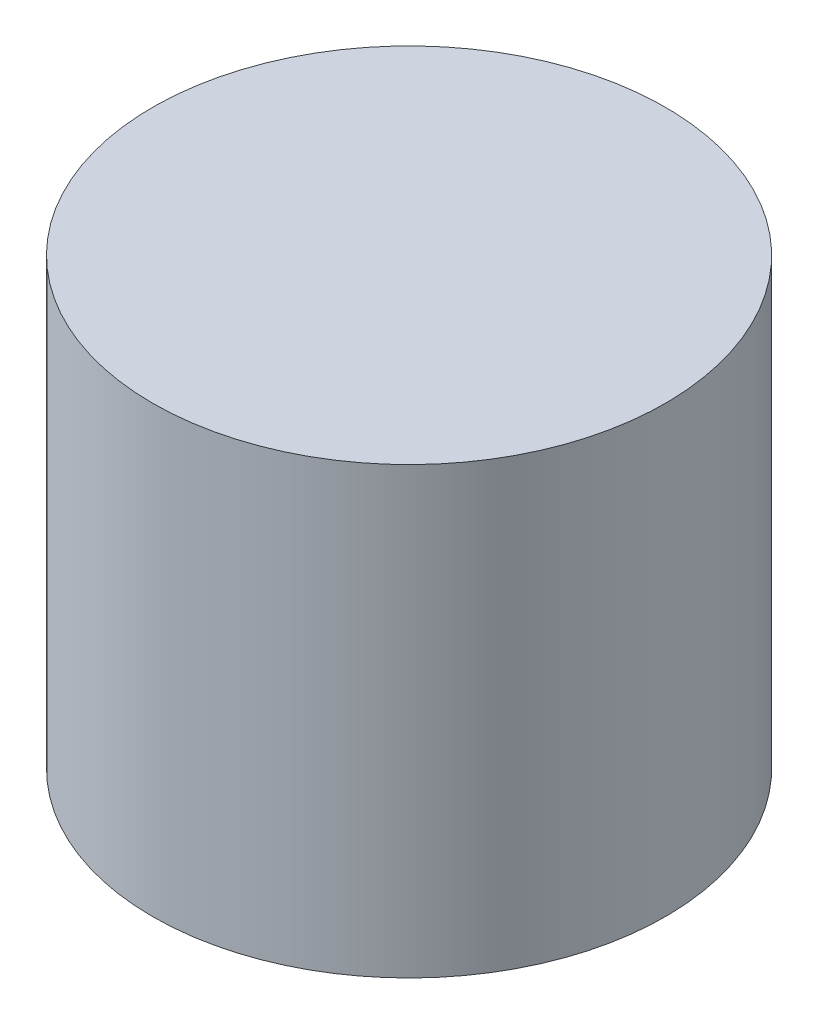
ISO-10303-21;
HEADER;
FILE_DESCRIPTION(('STEP AP214'),'2;1');
FILE_NAME('part.step','',(''),(''),'','','');
FILE_SCHEMA(('AUTOMOTIVE_DESIGN { 1 0 10303 214 1 1 1 1 }'));
ENDSEC;
DATA;
#1=APPLICATION_CONTEXT('core data for automotive mechanical design processes');
#2=APPLICATION_PROTOCOL_DEFINITION('international standard','automotive_design',2000,#1);
#3=PRODUCT_CONTEXT('',#1,'mechanical');
#4=PRODUCT('Part','Part','',(#3));
#5=PRODUCT_RELATED_PRODUCT_CATEGORY('part','',(#4));
#6=PRODUCT_DEFINITION_FORMATION('','',#4);
#7=PRODUCT_DEFINITION_CONTEXT('part definition',#1,'design');
#8=PRODUCT_DEFINITION('design','',#6,#7);
#9=PRODUCT_DEFINITION_SHAPE('','',#8);
#10=(LENGTH_UNIT() NAMED_UNIT(*) SI_UNIT(.MILLI.,.METRE.));
#11=(NAMED_UNIT(*) PLANE_ANGLE_UNIT() SI_UNIT($,.RADIAN.));
#12=(NAMED_UNIT(*) SI_UNIT($,.STERADIAN.) SOLID_ANGLE_UNIT());
#13=UNCERTAINTY_MEASURE_WITH_UNIT(LENGTH_MEASURE(1.E-05),#10,'distance_accuracy_value','');
#14=(GEOMETRIC_REPRESENTATION_CONTEXT(3) GLOBAL_UNCERTAINTY_ASSIGNED_CONTEXT((#13)) GLOBAL_UNIT_ASSIGNED_CONTEXT((#10,
#11,#12)) REPRESENTATION_CONTEXT('',''));
#15=CARTESIAN_POINT('',(0.,0.,0.));
#16=DIRECTION('',(0.,0.,1.));
#17=DIRECTION('',(1.,0.,0.));
#18=AXIS2_PLACEMENT_3D('',#15,#16,#17);
#19=CARTESIAN_POINT('',(0.,10.57,0.));
#20=DIRECTION('',(0.,-1.,0.));
#21=DIRECTION('',(0.,0.,-1.));
#22=AXIS2_PLACEMENT_3D('',#19,#20,#21);
#23=CYLINDRICAL_SURFACE('',#22,6.095);
#24=CARTESIAN_POINT('',(0.,10.57,0.));
#25=DIRECTION('',(0.,1.,0.));
#26=DIRECTION('',(0.,0.,1.));
#27=AXIS2_PLACEMENT_3D('',#24,#25,#26);
#28=CIRCLE('',#27,6.095);
#29=CARTESIAN_POINT('',(0.,10.57,6.095));
#30=VERTEX_POINT('',#29);
#31=EDGE_CURVE('E10',#30,#30,#28,.T.);
#32=ORIENTED_EDGE('',*,*,#31,.F.);
#33=EDGE_LOOP('',(#32));
#34=FACE_BOUND('',#33,.T.);
#35=CARTESIAN_POINT('',(0.,0.,0.));
#36=DIRECTION('',(0.,1.,0.));
#37=DIRECTION('',(0.,0.,1.));
#38=AXIS2_PLACEMENT_3D('',#35,#36,#37);
#39=CIRCLE('',#38,6.095);
#40=CARTESIAN_POINT('',(0.,0.,6.095));
#41=VERTEX_POINT('',#40);
#42=EDGE_CURVE('E34',#41,#41,#39,.T.);
#43=ORIENTED_EDGE('',*,*,#42,.T.);
#44=EDGE_LOOP('',(#43));
#45=FACE_BOUND('',#44,.T.);
#46=ADVANCED_FACE('F31',(#34,#45),#23,.T.);
#47=CARTESIAN_POINT('',(0.,10.57,0.));
#48=DIRECTION('',(0.,1.,0.));
#49=DIRECTION('',(0.,0.,1.));
#50=AXIS2_PLACEMENT_3D('',#47,#48,#49);
#51=PLANE('',#50);
#52=ORIENTED_EDGE('',*,*,#31,.T.);
#53=EDGE_LOOP('',(#52));
#54=FACE_BOUND('',#53,.T.);
#55=ADVANCED_FACE('F46',(#54),#51,.T.);
#56=CARTESIAN_POINT('',(0.,0.,0.));
#57=DIRECTION('',(0.,1.,0.));
#58=DIRECTION('',(0.,0.,1.));
#59=AXIS2_PLACEMENT_3D('',#56,#57,#58);
#60=PLANE('',#59);
#61=ORIENTED_EDGE('',*,*,#42,.F.);
#62=EDGE_LOOP('',(#61));
#63=FACE_BOUND('',#62,.T.);
#64=ADVANCED_FACE('F44',(#63),#60,.F.);
#65=CLOSED_SHELL('',(#46,#55,#64));
#66=MANIFOLD_SOLID_BREP('B2',#65);
#67=ADVANCED_BREP_SHAPE_REPRESENTATION('',(#18,#66),#14);
#68=SHAPE_DEFINITION_REPRESENTATION(#9,#67);
ENDSEC;
END-ISO-10303-21;
